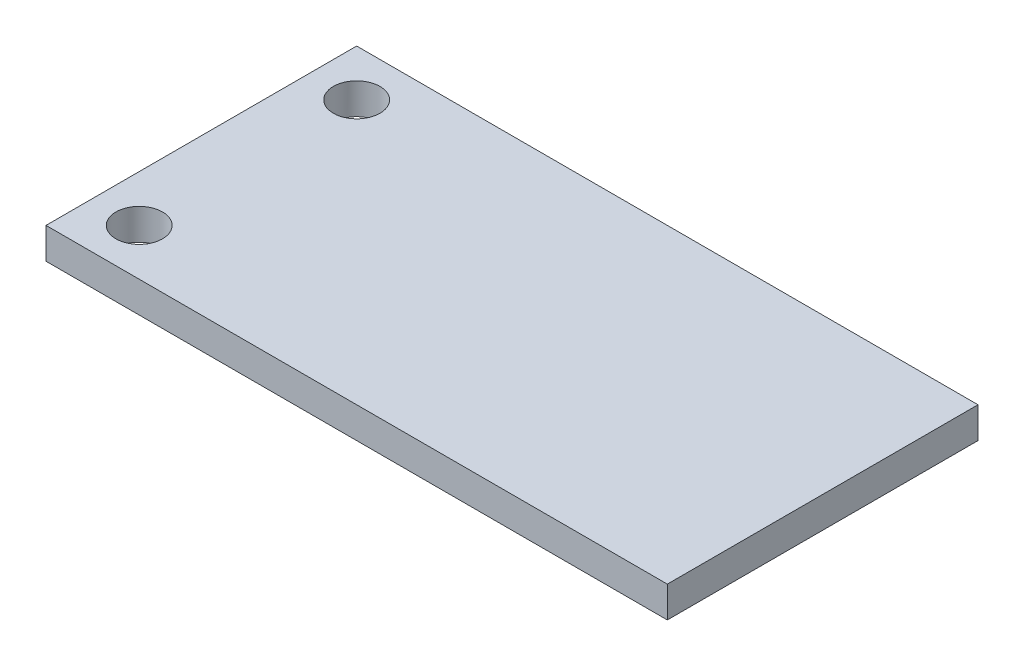
ISO-10303-21;
HEADER;
FILE_DESCRIPTION(('STEP AP214'),'2;1');
FILE_NAME('part.step','',(''),(''),'','','');
FILE_SCHEMA(('AUTOMOTIVE_DESIGN { 1 0 10303 214 1 1 1 1 }'));
ENDSEC;
DATA;
#1=APPLICATION_CONTEXT('core data for automotive mechanical design processes');
#2=APPLICATION_PROTOCOL_DEFINITION('international standard','automotive_design',2000,#1);
#3=PRODUCT_CONTEXT('',#1,'mechanical');
#4=PRODUCT('Part','Part','',(#3));
#5=PRODUCT_RELATED_PRODUCT_CATEGORY('part','',(#4));
#6=PRODUCT_DEFINITION_FORMATION('','',#4);
#7=PRODUCT_DEFINITION_CONTEXT('part definition',#1,'design');
#8=PRODUCT_DEFINITION('design','',#6,#7);
#9=PRODUCT_DEFINITION_SHAPE('','',#8);
#10=(LENGTH_UNIT() NAMED_UNIT(*) SI_UNIT(.MILLI.,.METRE.));
#11=(NAMED_UNIT(*) PLANE_ANGLE_UNIT() SI_UNIT($,.RADIAN.));
#12=(NAMED_UNIT(*) SI_UNIT($,.STERADIAN.) SOLID_ANGLE_UNIT());
#13=UNCERTAINTY_MEASURE_WITH_UNIT(LENGTH_MEASURE(1.E-05),#10,'distance_accuracy_value','');
#14=(GEOMETRIC_REPRESENTATION_CONTEXT(3) GLOBAL_UNCERTAINTY_ASSIGNED_CONTEXT((#13)) GLOBAL_UNIT_ASSIGNED_CONTEXT((#10,
#11,#12)) REPRESENTATION_CONTEXT('',''));
#15=CARTESIAN_POINT('',(0.,0.,0.));
#16=DIRECTION('',(0.,0.,1.));
#17=DIRECTION('',(1.,0.,0.));
#18=AXIS2_PLACEMENT_3D('',#15,#16,#17);
#19=CARTESIAN_POINT('',(0.,2.,0.));
#20=DIRECTION('',(1.,0.,0.));
#21=DIRECTION('',(0.,0.,-1.));
#22=AXIS2_PLACEMENT_3D('',#19,#20,#21);
#23=PLANE('',#22);
#24=DIRECTION('',(0.,0.,1.));
#25=VECTOR('',#24,1.);
#26=CARTESIAN_POINT('',(0.,0.,0.));
#27=LINE('',#26,#25);
#28=CARTESIAN_POINT('',(0.,0.,-20.));
#29=VERTEX_POINT('',#28);
#30=CARTESIAN_POINT('',(0.,0.,0.));
#31=VERTEX_POINT('',#30);
#32=EDGE_CURVE('E113',#29,#31,#27,.T.);
#33=ORIENTED_EDGE('',*,*,#32,.T.);
#34=DIRECTION('',(0.,-1.,0.));
#35=VECTOR('',#34,1.);
#36=CARTESIAN_POINT('',(0.,2.,0.));
#37=LINE('',#36,#35);
#38=CARTESIAN_POINT('',(0.,2.,0.));
#39=VERTEX_POINT('',#38);
#40=EDGE_CURVE('E11',#39,#31,#37,.T.);
#41=ORIENTED_EDGE('',*,*,#40,.F.);
#42=DIRECTION('',(0.,0.,1.));
#43=VECTOR('',#42,1.);
#44=CARTESIAN_POINT('',(0.,2.,0.));
#45=LINE('',#44,#43);
#46=CARTESIAN_POINT('',(0.,2.,-20.));
#47=VERTEX_POINT('',#46);
#48=EDGE_CURVE('E97',#47,#39,#45,.T.);
#49=ORIENTED_EDGE('',*,*,#48,.F.);
#50=DIRECTION('',(0.,-1.,0.));
#51=VECTOR('',#50,1.);
#52=CARTESIAN_POINT('',(0.,2.,-20.));
#53=LINE('',#52,#51);
#54=EDGE_CURVE('E109',#47,#29,#53,.T.);
#55=ORIENTED_EDGE('',*,*,#54,.T.);
#56=EDGE_LOOP('',(#33,#41,#49,#55));
#57=FACE_BOUND('',#56,.T.);
#58=ADVANCED_FACE('F45',(#57),#23,.F.);
#59=CARTESIAN_POINT('',(0.,2.,0.));
#60=DIRECTION('',(0.,0.,-1.));
#61=DIRECTION('',(-1.,0.,0.));
#62=AXIS2_PLACEMENT_3D('',#59,#60,#61);
#63=PLANE('',#62);
#64=DIRECTION('',(1.,0.,0.));
#65=VECTOR('',#64,1.);
#66=CARTESIAN_POINT('',(0.,0.,0.));
#67=LINE('',#66,#65);
#68=CARTESIAN_POINT('',(40.,0.,0.));
#69=VERTEX_POINT('',#68);
#70=EDGE_CURVE('E102',#31,#69,#67,.T.);
#71=ORIENTED_EDGE('',*,*,#70,.T.);
#72=DIRECTION('',(0.,-1.,0.));
#73=VECTOR('',#72,1.);
#74=CARTESIAN_POINT('',(40.,2.,0.));
#75=LINE('',#74,#73);
#76=CARTESIAN_POINT('',(40.,2.,0.));
#77=VERTEX_POINT('',#76);
#78=EDGE_CURVE('E54',#77,#69,#75,.T.);
#79=ORIENTED_EDGE('',*,*,#78,.F.);
#80=DIRECTION('',(1.,0.,0.));
#81=VECTOR('',#80,1.);
#82=CARTESIAN_POINT('',(0.,2.,0.));
#83=LINE('',#82,#81);
#84=EDGE_CURVE('E92',#39,#77,#83,.T.);
#85=ORIENTED_EDGE('',*,*,#84,.F.);
#86=ORIENTED_EDGE('',*,*,#40,.T.);
#87=EDGE_LOOP('',(#71,#79,#85,#86));
#88=FACE_BOUND('',#87,.T.);
#89=ADVANCED_FACE('F101',(#88),#63,.F.);
#90=CARTESIAN_POINT('',(40.,2.,0.));
#91=DIRECTION('',(-1.,0.,0.));
#92=DIRECTION('',(0.,0.,1.));
#93=AXIS2_PLACEMENT_3D('',#90,#91,#92);
#94=PLANE('',#93);
#95=DIRECTION('',(0.,0.,-1.));
#96=VECTOR('',#95,1.);
#97=CARTESIAN_POINT('',(40.,0.,0.));
#98=LINE('',#97,#96);
#99=CARTESIAN_POINT('',(40.,0.,-20.));
#100=VERTEX_POINT('',#99);
#101=EDGE_CURVE('E79',#69,#100,#98,.T.);
#102=ORIENTED_EDGE('',*,*,#101,.T.);
#103=DIRECTION('',(0.,-1.,0.));
#104=VECTOR('',#103,1.);
#105=CARTESIAN_POINT('',(40.,2.,-20.));
#106=LINE('',#105,#104);
#107=CARTESIAN_POINT('',(40.,2.,-20.));
#108=VERTEX_POINT('',#107);
#109=EDGE_CURVE('E104',#108,#100,#106,.T.);
#110=ORIENTED_EDGE('',*,*,#109,.F.);
#111=DIRECTION('',(0.,0.,-1.));
#112=VECTOR('',#111,1.);
#113=CARTESIAN_POINT('',(40.,2.,0.));
#114=LINE('',#113,#112);
#115=EDGE_CURVE('E95',#77,#108,#114,.T.);
#116=ORIENTED_EDGE('',*,*,#115,.F.);
#117=ORIENTED_EDGE('',*,*,#78,.T.);
#118=EDGE_LOOP('',(#102,#110,#116,#117));
#119=FACE_BOUND('',#118,.T.);
#120=ADVANCED_FACE('F105',(#119),#94,.F.);
#121=CARTESIAN_POINT('',(0.,2.,-20.));
#122=DIRECTION('',(0.,0.,1.));
#123=DIRECTION('',(1.,0.,0.));
#124=AXIS2_PLACEMENT_3D('',#121,#122,#123);
#125=PLANE('',#124);
#126=DIRECTION('',(-1.,0.,0.));
#127=VECTOR('',#126,1.);
#128=CARTESIAN_POINT('',(0.,0.,-20.));
#129=LINE('',#128,#127);
#130=EDGE_CURVE('E85',#100,#29,#129,.T.);
#131=ORIENTED_EDGE('',*,*,#130,.T.);
#132=ORIENTED_EDGE('',*,*,#54,.F.);
#133=DIRECTION('',(-1.,0.,0.));
#134=VECTOR('',#133,1.);
#135=CARTESIAN_POINT('',(0.,2.,-20.));
#136=LINE('',#135,#134);
#137=EDGE_CURVE('E62',#108,#47,#136,.T.);
#138=ORIENTED_EDGE('',*,*,#137,.F.);
#139=ORIENTED_EDGE('',*,*,#109,.T.);
#140=EDGE_LOOP('',(#131,#132,#138,#139));
#141=FACE_BOUND('',#140,.T.);
#142=ADVANCED_FACE('F127',(#141),#125,.F.);
#143=CARTESIAN_POINT('',(0.,2.,0.));
#144=DIRECTION('',(0.,-1.,0.));
#145=DIRECTION('',(0.,0.,-1.));
#146=AXIS2_PLACEMENT_3D('',#143,#144,#145);
#147=PLANE('',#146);
#148=CARTESIAN_POINT('',(3.,2.,-3.));
#149=DIRECTION('',(0.,-1.,0.));
#150=DIRECTION('',(0.,0.,-1.));
#151=AXIS2_PLACEMENT_3D('',#148,#149,#150);
#152=CIRCLE('',#151,1.5);
#153=CARTESIAN_POINT('',(3.,2.,-4.5));
#154=VERTEX_POINT('',#153);
#155=EDGE_CURVE('E145',#154,#154,#152,.T.);
#156=ORIENTED_EDGE('',*,*,#155,.T.);
#157=EDGE_LOOP('',(#156));
#158=FACE_BOUND('',#157,.T.);
#159=CARTESIAN_POINT('',(3.,2.,-17.));
#160=DIRECTION('',(0.,1.,0.));
#161=DIRECTION('',(0.,0.,1.));
#162=AXIS2_PLACEMENT_3D('',#159,#160,#161);
#163=CIRCLE('',#162,1.5);
#164=CARTESIAN_POINT('',(3.,2.,-15.5));
#165=VERTEX_POINT('',#164);
#166=EDGE_CURVE('E117',#165,#165,#163,.T.);
#167=ORIENTED_EDGE('',*,*,#166,.F.);
#168=EDGE_LOOP('',(#167));
#169=FACE_BOUND('',#168,.T.);
#170=ORIENTED_EDGE('',*,*,#48,.T.);
#171=ORIENTED_EDGE('',*,*,#84,.T.);
#172=ORIENTED_EDGE('',*,*,#115,.T.);
#173=ORIENTED_EDGE('',*,*,#137,.T.);
#174=EDGE_LOOP('',(#170,#171,#172,#173));
#175=FACE_BOUND('',#174,.T.);
#176=ADVANCED_FACE('F93',(#158,#169,#175),#147,.F.);
#177=CARTESIAN_POINT('',(0.,0.,0.));
#178=DIRECTION('',(0.,-1.,0.));
#179=DIRECTION('',(0.,0.,-1.));
#180=AXIS2_PLACEMENT_3D('',#177,#178,#179);
#181=PLANE('',#180);
#182=CARTESIAN_POINT('',(3.,0.,-3.));
#183=DIRECTION('',(0.,-1.,0.));
#184=DIRECTION('',(0.,0.,-1.));
#185=AXIS2_PLACEMENT_3D('',#182,#183,#184);
#186=CIRCLE('',#185,1.5);
#187=CARTESIAN_POINT('',(3.,0.,-4.5));
#188=VERTEX_POINT('',#187);
#189=EDGE_CURVE('E138',#188,#188,#186,.T.);
#190=ORIENTED_EDGE('',*,*,#189,.F.);
#191=EDGE_LOOP('',(#190));
#192=FACE_BOUND('',#191,.T.);
#193=CARTESIAN_POINT('',(3.,0.,-17.));
#194=DIRECTION('',(0.,-1.,0.));
#195=DIRECTION('',(0.,0.,-1.));
#196=AXIS2_PLACEMENT_3D('',#193,#194,#195);
#197=CIRCLE('',#196,1.5);
#198=CARTESIAN_POINT('',(3.,0.,-18.5));
#199=VERTEX_POINT('',#198);
#200=EDGE_CURVE('E134',#199,#199,#197,.F.);
#201=ORIENTED_EDGE('',*,*,#200,.T.);
#202=EDGE_LOOP('',(#201));
#203=FACE_BOUND('',#202,.T.);
#204=ORIENTED_EDGE('',*,*,#32,.F.);
#205=ORIENTED_EDGE('',*,*,#130,.F.);
#206=ORIENTED_EDGE('',*,*,#101,.F.);
#207=ORIENTED_EDGE('',*,*,#70,.F.);
#208=EDGE_LOOP('',(#204,#205,#206,#207));
#209=FACE_BOUND('',#208,.T.);
#210=ADVANCED_FACE('F130',(#192,#203,#209),#181,.T.);
#211=CARTESIAN_POINT('',(3.,-0.00100000000000013,-17.));
#212=DIRECTION('',(0.,1.,0.));
#213=DIRECTION('',(0.,0.,1.));
#214=AXIS2_PLACEMENT_3D('',#211,#212,#213);
#215=CYLINDRICAL_SURFACE('',#214,1.5);
#216=ORIENTED_EDGE('',*,*,#200,.F.);
#217=EDGE_LOOP('',(#216));
#218=FACE_BOUND('',#217,.T.);
#219=ORIENTED_EDGE('',*,*,#166,.T.);
#220=EDGE_LOOP('',(#219));
#221=FACE_BOUND('',#220,.T.);
#222=ADVANCED_FACE('F154',(#218,#221),#215,.F.);
#223=CARTESIAN_POINT('',(3.,-0.00100000000000013,-3.));
#224=DIRECTION('',(0.,1.,0.));
#225=DIRECTION('',(0.,0.,1.));
#226=AXIS2_PLACEMENT_3D('',#223,#224,#225);
#227=CYLINDRICAL_SURFACE('',#226,1.5);
#228=ORIENTED_EDGE('',*,*,#189,.T.);
#229=EDGE_LOOP('',(#228));
#230=FACE_BOUND('',#229,.T.);
#231=ORIENTED_EDGE('',*,*,#155,.F.);
#232=EDGE_LOOP('',(#231));
#233=FACE_BOUND('',#232,.T.);
#234=ADVANCED_FACE('F152',(#230,#233),#227,.F.);
#235=CLOSED_SHELL('',(#58,#89,#120,#142,#176,#210,#222,#234));
#236=MANIFOLD_SOLID_BREP('B2',#235);
#237=ADVANCED_BREP_SHAPE_REPRESENTATION('',(#18,#236),#14);
#238=SHAPE_DEFINITION_REPRESENTATION(#9,#237);
ENDSEC;
END-ISO-10303-21;
